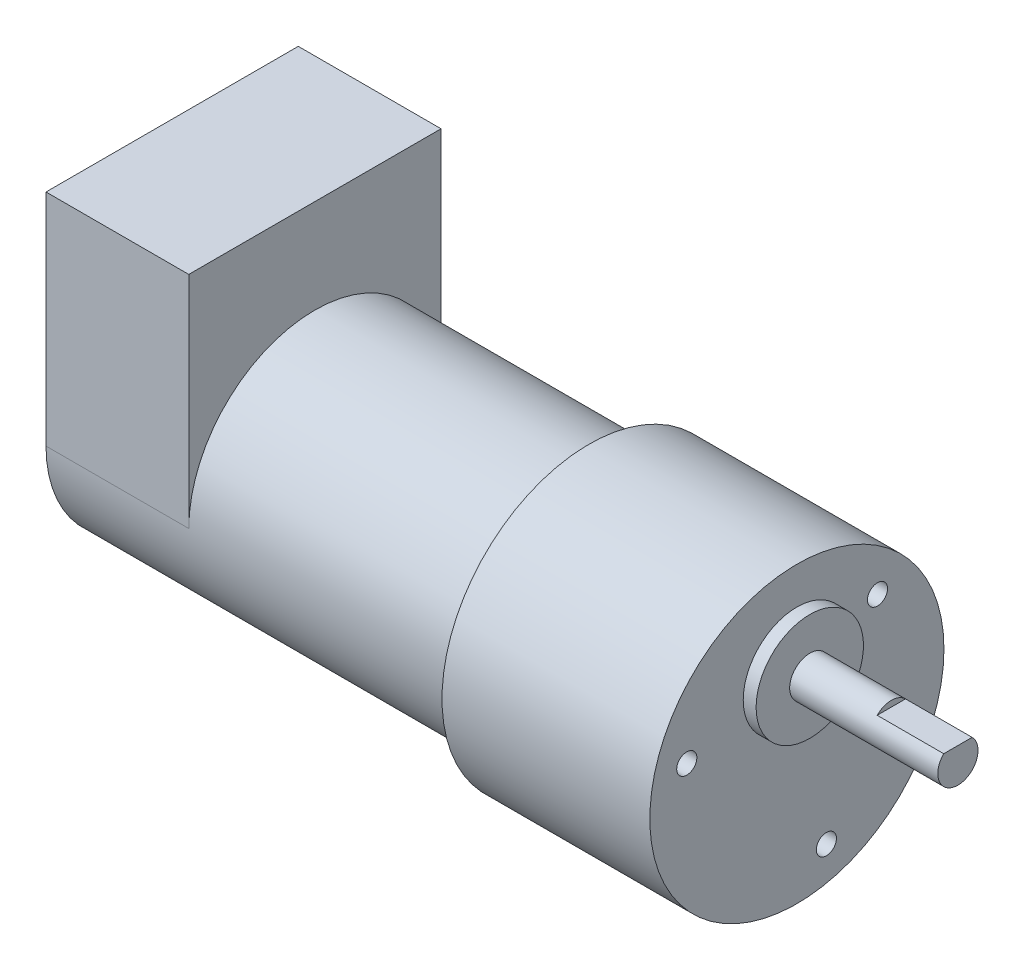
ISO-10303-21;
HEADER;
FILE_DESCRIPTION(('STEP AP214'),'2;1');
FILE_NAME('part.step','',(''),(''),'','','');
FILE_SCHEMA(('AUTOMOTIVE_DESIGN { 1 0 10303 214 1 1 1 1 }'));
ENDSEC;
DATA;
#1=APPLICATION_CONTEXT('core data for automotive mechanical design processes');
#2=APPLICATION_PROTOCOL_DEFINITION('international standard','automotive_design',2000,#1);
#3=PRODUCT_CONTEXT('',#1,'mechanical');
#4=PRODUCT('Part','Part','',(#3));
#5=PRODUCT_RELATED_PRODUCT_CATEGORY('part','',(#4));
#6=PRODUCT_DEFINITION_FORMATION('','',#4);
#7=PRODUCT_DEFINITION_CONTEXT('part definition',#1,'design');
#8=PRODUCT_DEFINITION('design','',#6,#7);
#9=PRODUCT_DEFINITION_SHAPE('','',#8);
#10=(LENGTH_UNIT() NAMED_UNIT(*) SI_UNIT(.MILLI.,.METRE.));
#11=(NAMED_UNIT(*) PLANE_ANGLE_UNIT() SI_UNIT($,.RADIAN.));
#12=(NAMED_UNIT(*) SI_UNIT($,.STERADIAN.) SOLID_ANGLE_UNIT());
#13=UNCERTAINTY_MEASURE_WITH_UNIT(LENGTH_MEASURE(1.E-05),#10,'distance_accuracy_value','');
#14=(GEOMETRIC_REPRESENTATION_CONTEXT(3) GLOBAL_UNCERTAINTY_ASSIGNED_CONTEXT((#13)) GLOBAL_UNIT_ASSIGNED_CONTEXT((#10,
#11,#12)) REPRESENTATION_CONTEXT('',''));
#15=CARTESIAN_POINT('',(0.,0.,0.));
#16=DIRECTION('',(0.,0.,1.));
#17=DIRECTION('',(1.,0.,0.));
#18=AXIS2_PLACEMENT_3D('',#15,#16,#17);
#19=CARTESIAN_POINT('',(73.914,0.,0.));
#20=DIRECTION('',(1.,0.,0.));
#21=DIRECTION('',(0.,0.,-1.));
#22=AXIS2_PLACEMENT_3D('',#19,#20,#21);
#23=PLANE('',#22);
#24=CARTESIAN_POINT('',(73.914,9.53703200057546,-9.53703200057543));
#25=DIRECTION('',(1.,0.,0.));
#26=DIRECTION('',(0.,0.,-1.));
#27=AXIS2_PLACEMENT_3D('',#24,#25,#26);
#28=CIRCLE('',#27,1.190625);
#29=CARTESIAN_POINT('',(73.914,9.53703200057546,-10.7276570005754));
#30=VERTEX_POINT('',#29);
#31=EDGE_CURVE('E103',#30,#30,#28,.T.);
#32=ORIENTED_EDGE('',*,*,#31,.F.);
#33=EDGE_LOOP('',(#32));
#34=FACE_BOUND('',#33,.T.);
#35=CARTESIAN_POINT('',(73.914,3.49079598891572,13.0278279894912));
#36=DIRECTION('',(1.,0.,0.));
#37=DIRECTION('',(0.,0.,-1.));
#38=AXIS2_PLACEMENT_3D('',#35,#36,#37);
#39=CIRCLE('',#38,1.190625);
#40=CARTESIAN_POINT('',(73.914,3.49079598891572,11.8372029894912));
#41=VERTEX_POINT('',#40);
#42=EDGE_CURVE('E110',#41,#41,#39,.T.);
#43=ORIENTED_EDGE('',*,*,#42,.F.);
#44=EDGE_LOOP('',(#43));
#45=FACE_BOUND('',#44,.T.);
#46=CARTESIAN_POINT('',(73.914,-13.0278279894912,-3.49079598891575));
#47=DIRECTION('',(1.,0.,0.));
#48=DIRECTION('',(0.,0.,-1.));
#49=AXIS2_PLACEMENT_3D('',#46,#47,#48);
#50=CIRCLE('',#49,1.190625);
#51=CARTESIAN_POINT('',(73.914,-13.0278279894912,-4.68142098891575));
#52=VERTEX_POINT('',#51);
#53=EDGE_CURVE('E116',#52,#52,#50,.T.);
#54=ORIENTED_EDGE('',*,*,#53,.F.);
#55=EDGE_LOOP('',(#54));
#56=FACE_BOUND('',#55,.T.);
#57=CARTESIAN_POINT('',(73.914,0.,0.));
#58=DIRECTION('',(1.,0.,0.));
#59=DIRECTION('',(0.,0.,-1.));
#60=AXIS2_PLACEMENT_3D('',#57,#58,#59);
#61=CIRCLE('',#60,17.399);
#62=CARTESIAN_POINT('',(73.914,0.,-17.399));
#63=VERTEX_POINT('',#62);
#64=EDGE_CURVE('E132',#63,#63,#61,.T.);
#65=ORIENTED_EDGE('',*,*,#64,.T.);
#66=EDGE_LOOP('',(#65));
#67=FACE_BOUND('',#66,.T.);
#68=CARTESIAN_POINT('',(73.914,6.6548,0.));
#69=DIRECTION('',(1.,0.,0.));
#70=DIRECTION('',(0.,0.,-1.));
#71=AXIS2_PLACEMENT_3D('',#68,#69,#70);
#72=CIRCLE('',#71,6.35);
#73=CARTESIAN_POINT('',(73.914,6.6548,6.35));
#74=VERTEX_POINT('',#73);
#75=EDGE_CURVE('E122',#74,#74,#72,.T.);
#76=ORIENTED_EDGE('',*,*,#75,.F.);
#77=EDGE_LOOP('',(#76));
#78=FACE_BOUND('',#77,.T.);
#79=ADVANCED_FACE('F33',(#34,#45,#56,#67,#78),#23,.T.);
#80=CARTESIAN_POINT('',(49.3268,0.,0.));
#81=DIRECTION('',(-1.,0.,0.));
#82=DIRECTION('',(0.,0.,1.));
#83=AXIS2_PLACEMENT_3D('',#80,#81,#82);
#84=CYLINDRICAL_SURFACE('',#83,14.9225);
#85=CARTESIAN_POINT('',(16.891,0.,0.));
#86=DIRECTION('',(1.,0.,0.));
#87=DIRECTION('',(0.,0.,-1.));
#88=AXIS2_PLACEMENT_3D('',#85,#86,#87);
#89=CIRCLE('',#88,14.9225);
#90=CARTESIAN_POINT('',(16.891,0.,-14.9225));
#91=VERTEX_POINT('',#90);
#92=CARTESIAN_POINT('',(16.891,0.,14.9225));
#93=VERTEX_POINT('',#92);
#94=EDGE_CURVE('E11',#91,#93,#89,.T.);
#95=ORIENTED_EDGE('',*,*,#94,.T.);
#96=DIRECTION('',(-1.,0.,0.));
#97=VECTOR('',#96,1.);
#98=CARTESIAN_POINT('',(16.891,0.,14.9225));
#99=LINE('',#98,#97);
#100=CARTESIAN_POINT('',(0.,0.,14.9225));
#101=VERTEX_POINT('',#100);
#102=EDGE_CURVE('E148',#93,#101,#99,.T.);
#103=ORIENTED_EDGE('',*,*,#102,.T.);
#104=CARTESIAN_POINT('',(0.,0.,0.));
#105=DIRECTION('',(1.,0.,0.));
#106=DIRECTION('',(0.,0.,-1.));
#107=AXIS2_PLACEMENT_3D('',#104,#105,#106);
#108=CIRCLE('',#107,14.9225);
#109=CARTESIAN_POINT('',(0.,0.,-14.9225));
#110=VERTEX_POINT('',#109);
#111=EDGE_CURVE('E157',#101,#110,#108,.T.);
#112=ORIENTED_EDGE('',*,*,#111,.T.);
#113=DIRECTION('',(-1.,0.,0.));
#114=VECTOR('',#113,1.);
#115=CARTESIAN_POINT('',(16.891,0.,-14.9225));
#116=LINE('',#115,#114);
#117=EDGE_CURVE('E55',#91,#110,#116,.T.);
#118=ORIENTED_EDGE('',*,*,#117,.F.);
#119=EDGE_LOOP('',(#95,#103,#112,#118));
#120=FACE_BOUND('',#119,.T.);
#121=CARTESIAN_POINT('',(49.3268,0.,0.));
#122=DIRECTION('',(1.,0.,0.));
#123=DIRECTION('',(0.,0.,-1.));
#124=AXIS2_PLACEMENT_3D('',#121,#122,#123);
#125=CIRCLE('',#124,14.9225);
#126=CARTESIAN_POINT('',(49.3268,0.,-14.9225));
#127=VERTEX_POINT('',#126);
#128=EDGE_CURVE('E42',#127,#127,#125,.T.);
#129=ORIENTED_EDGE('',*,*,#128,.F.);
#130=EDGE_LOOP('',(#129));
#131=FACE_BOUND('',#130,.T.);
#132=ADVANCED_FACE('F35',(#120,#131),#84,.T.);
#133=CARTESIAN_POINT('',(0.,0.,0.));
#134=DIRECTION('',(1.,0.,0.));
#135=DIRECTION('',(0.,0.,-1.));
#136=AXIS2_PLACEMENT_3D('',#133,#134,#135);
#137=PLANE('',#136);
#138=ORIENTED_EDGE('',*,*,#111,.F.);
#139=DIRECTION('',(0.,1.,0.));
#140=VECTOR('',#139,1.);
#141=CARTESIAN_POINT('',(0.,26.035,14.9225));
#142=LINE('',#141,#140);
#143=CARTESIAN_POINT('',(0.,26.035,14.9225));
#144=VERTEX_POINT('',#143);
#145=EDGE_CURVE('E135',#101,#144,#142,.T.);
#146=ORIENTED_EDGE('',*,*,#145,.T.);
#147=DIRECTION('',(0.,0.,-1.));
#148=VECTOR('',#147,1.);
#149=CARTESIAN_POINT('',(0.,26.035,-14.9225));
#150=LINE('',#149,#148);
#151=CARTESIAN_POINT('',(0.,26.035,-14.9225));
#152=VERTEX_POINT('',#151);
#153=EDGE_CURVE('E151',#144,#152,#150,.T.);
#154=ORIENTED_EDGE('',*,*,#153,.T.);
#155=DIRECTION('',(0.,-1.,0.));
#156=VECTOR('',#155,1.);
#157=CARTESIAN_POINT('',(0.,26.035,-14.9225));
#158=LINE('',#157,#156);
#159=EDGE_CURVE('E142',#152,#110,#158,.T.);
#160=ORIENTED_EDGE('',*,*,#159,.T.);
#161=EDGE_LOOP('',(#138,#146,#154,#160));
#162=FACE_BOUND('',#161,.T.);
#163=ADVANCED_FACE('F174',(#162),#137,.F.);
#164=CARTESIAN_POINT('',(16.891,0.,0.));
#165=DIRECTION('',(1.,0.,0.));
#166=DIRECTION('',(0.,0.,-1.));
#167=AXIS2_PLACEMENT_3D('',#164,#165,#166);
#168=PLANE('',#167);
#169=ORIENTED_EDGE('',*,*,#94,.F.);
#170=DIRECTION('',(0.,-1.,0.));
#171=VECTOR('',#170,1.);
#172=CARTESIAN_POINT('',(16.891,26.035,-14.9225));
#173=LINE('',#172,#171);
#174=CARTESIAN_POINT('',(16.891,26.035,-14.9225));
#175=VERTEX_POINT('',#174);
#176=EDGE_CURVE('E145',#175,#91,#173,.T.);
#177=ORIENTED_EDGE('',*,*,#176,.F.);
#178=DIRECTION('',(0.,0.,-1.));
#179=VECTOR('',#178,1.);
#180=CARTESIAN_POINT('',(16.891,26.035,-14.9225));
#181=LINE('',#180,#179);
#182=CARTESIAN_POINT('',(16.891,26.035,14.9225));
#183=VERTEX_POINT('',#182);
#184=EDGE_CURVE('E141',#183,#175,#181,.T.);
#185=ORIENTED_EDGE('',*,*,#184,.F.);
#186=DIRECTION('',(0.,1.,0.));
#187=VECTOR('',#186,1.);
#188=CARTESIAN_POINT('',(16.891,26.035,14.9225));
#189=LINE('',#188,#187);
#190=EDGE_CURVE('E138',#93,#183,#189,.T.);
#191=ORIENTED_EDGE('',*,*,#190,.F.);
#192=EDGE_LOOP('',(#169,#177,#185,#191));
#193=FACE_BOUND('',#192,.T.);
#194=ADVANCED_FACE('F181',(#193),#168,.T.);
#195=CARTESIAN_POINT('',(16.891,26.035,-14.9225));
#196=DIRECTION('',(0.,0.,-1.));
#197=DIRECTION('',(0.,1.,0.));
#198=AXIS2_PLACEMENT_3D('',#195,#196,#197);
#199=PLANE('',#198);
#200=ORIENTED_EDGE('',*,*,#159,.F.);
#201=DIRECTION('',(-1.,0.,0.));
#202=VECTOR('',#201,1.);
#203=CARTESIAN_POINT('',(16.891,26.035,-14.9225));
#204=LINE('',#203,#202);
#205=EDGE_CURVE('E158',#175,#152,#204,.T.);
#206=ORIENTED_EDGE('',*,*,#205,.F.);
#207=ORIENTED_EDGE('',*,*,#176,.T.);
#208=ORIENTED_EDGE('',*,*,#117,.T.);
#209=EDGE_LOOP('',(#200,#206,#207,#208));
#210=FACE_BOUND('',#209,.T.);
#211=ADVANCED_FACE('F172',(#210),#199,.T.);
#212=CARTESIAN_POINT('',(16.891,26.035,-14.9225));
#213=DIRECTION('',(0.,1.,0.));
#214=DIRECTION('',(0.,0.,1.));
#215=AXIS2_PLACEMENT_3D('',#212,#213,#214);
#216=PLANE('',#215);
#217=ORIENTED_EDGE('',*,*,#153,.F.);
#218=DIRECTION('',(-1.,0.,0.));
#219=VECTOR('',#218,1.);
#220=CARTESIAN_POINT('',(16.891,26.035,14.9225));
#221=LINE('',#220,#219);
#222=EDGE_CURVE('E160',#183,#144,#221,.T.);
#223=ORIENTED_EDGE('',*,*,#222,.F.);
#224=ORIENTED_EDGE('',*,*,#184,.T.);
#225=ORIENTED_EDGE('',*,*,#205,.T.);
#226=EDGE_LOOP('',(#217,#223,#224,#225));
#227=FACE_BOUND('',#226,.T.);
#228=ADVANCED_FACE('F177',(#227),#216,.T.);
#229=CARTESIAN_POINT('',(16.891,26.035,14.9225));
#230=DIRECTION('',(0.,0.,1.));
#231=DIRECTION('',(0.,-1.,0.));
#232=AXIS2_PLACEMENT_3D('',#229,#230,#231);
#233=PLANE('',#232);
#234=ORIENTED_EDGE('',*,*,#145,.F.);
#235=ORIENTED_EDGE('',*,*,#102,.F.);
#236=ORIENTED_EDGE('',*,*,#190,.T.);
#237=ORIENTED_EDGE('',*,*,#222,.T.);
#238=EDGE_LOOP('',(#234,#235,#236,#237));
#239=FACE_BOUND('',#238,.T.);
#240=ADVANCED_FACE('F183',(#239),#233,.T.);
#241=CARTESIAN_POINT('',(49.3268,0.,0.));
#242=DIRECTION('',(1.,0.,0.));
#243=DIRECTION('',(0.,0.,-1.));
#244=AXIS2_PLACEMENT_3D('',#241,#242,#243);
#245=PLANE('',#244);
#246=CARTESIAN_POINT('',(49.3268,0.,0.));
#247=DIRECTION('',(1.,0.,0.));
#248=DIRECTION('',(0.,0.,-1.));
#249=AXIS2_PLACEMENT_3D('',#246,#247,#248);
#250=CIRCLE('',#249,17.399);
#251=CARTESIAN_POINT('',(49.3268,0.,-17.399));
#252=VERTEX_POINT('',#251);
#253=EDGE_CURVE('E131',#252,#252,#250,.T.);
#254=ORIENTED_EDGE('',*,*,#253,.F.);
#255=EDGE_LOOP('',(#254));
#256=FACE_BOUND('',#255,.T.);
#257=ORIENTED_EDGE('',*,*,#128,.T.);
#258=EDGE_LOOP('',(#257));
#259=FACE_BOUND('',#258,.T.);
#260=ADVANCED_FACE('F185',(#256,#259),#245,.F.);
#261=CARTESIAN_POINT('',(73.914,0.,0.));
#262=DIRECTION('',(-1.,0.,0.));
#263=DIRECTION('',(0.,0.,1.));
#264=AXIS2_PLACEMENT_3D('',#261,#262,#263);
#265=CYLINDRICAL_SURFACE('',#264,17.399);
#266=ORIENTED_EDGE('',*,*,#64,.F.);
#267=EDGE_LOOP('',(#266));
#268=FACE_BOUND('',#267,.T.);
#269=ORIENTED_EDGE('',*,*,#253,.T.);
#270=EDGE_LOOP('',(#269));
#271=FACE_BOUND('',#270,.T.);
#272=ADVANCED_FACE('F191',(#268,#271),#265,.T.);
#273=CARTESIAN_POINT('',(75.438,6.6548,0.));
#274=DIRECTION('',(1.,0.,0.));
#275=DIRECTION('',(0.,0.,-1.));
#276=AXIS2_PLACEMENT_3D('',#273,#274,#275);
#277=PLANE('',#276);
#278=CARTESIAN_POINT('',(75.438,6.6548,0.));
#279=DIRECTION('',(1.,0.,0.));
#280=DIRECTION('',(0.,0.,-1.));
#281=AXIS2_PLACEMENT_3D('',#278,#279,#280);
#282=CIRCLE('',#281,6.35);
#283=CARTESIAN_POINT('',(75.438,6.6548,6.35));
#284=VERTEX_POINT('',#283);
#285=EDGE_CURVE('E125',#284,#284,#282,.T.);
#286=ORIENTED_EDGE('',*,*,#285,.T.);
#287=EDGE_LOOP('',(#286));
#288=FACE_BOUND('',#287,.T.);
#289=CARTESIAN_POINT('',(75.438,6.6548,0.));
#290=DIRECTION('',(1.,0.,0.));
#291=DIRECTION('',(0.,0.,-1.));
#292=AXIS2_PLACEMENT_3D('',#289,#290,#291);
#293=CIRCLE('',#292,2.37871);
#294=CARTESIAN_POINT('',(75.438,6.6548,-2.37871));
#295=VERTEX_POINT('',#294);
#296=EDGE_CURVE('E37',#295,#295,#293,.T.);
#297=ORIENTED_EDGE('',*,*,#296,.F.);
#298=EDGE_LOOP('',(#297));
#299=FACE_BOUND('',#298,.T.);
#300=ADVANCED_FACE('F208',(#288,#299),#277,.T.);
#301=CARTESIAN_POINT('',(75.438,6.6548,0.));
#302=DIRECTION('',(-1.,0.,0.));
#303=DIRECTION('',(0.,0.,1.));
#304=AXIS2_PLACEMENT_3D('',#301,#302,#303);
#305=CYLINDRICAL_SURFACE('',#304,6.35);
#306=CARTESIAN_POINT('',(75.438,6.6548,6.35));
#307=CARTESIAN_POINT('',(75.422125,6.6548,6.35));
#308=CARTESIAN_POINT('',(75.40625,6.6548,6.35));
#309=CARTESIAN_POINT('',(75.3745,6.6548,6.35));
#310=CARTESIAN_POINT('',(75.358625,6.6548,6.35));
#311=CARTESIAN_POINT('',(75.326875,6.6548,6.35));
#312=CARTESIAN_POINT('',(75.311,6.6548,6.35));
#313=CARTESIAN_POINT('',(75.27925,6.6548,6.35));
#314=CARTESIAN_POINT('',(75.263375,6.6548,6.35));
#315=CARTESIAN_POINT('',(75.231625,6.6548,6.35));
#316=CARTESIAN_POINT('',(75.21575,6.6548,6.35));
#317=CARTESIAN_POINT('',(75.184,6.6548,6.35));
#318=CARTESIAN_POINT('',(75.168125,6.6548,6.35));
#319=CARTESIAN_POINT('',(75.136375,6.6548,6.35));
#320=CARTESIAN_POINT('',(75.1205,6.6548,6.35));
#321=CARTESIAN_POINT('',(75.08875,6.6548,6.35));
#322=CARTESIAN_POINT('',(75.072875,6.6548,6.35));
#323=CARTESIAN_POINT('',(75.041125,6.6548,6.35));
#324=CARTESIAN_POINT('',(75.02525,6.6548,6.35));
#325=CARTESIAN_POINT('',(74.9935,6.6548,6.35));
#326=CARTESIAN_POINT('',(74.977625,6.6548,6.35));
#327=CARTESIAN_POINT('',(74.945875,6.6548,6.35));
#328=CARTESIAN_POINT('',(74.93,6.6548,6.35));
#329=CARTESIAN_POINT('',(74.89825,6.6548,6.35));
#330=CARTESIAN_POINT('',(74.882375,6.6548,6.35));
#331=CARTESIAN_POINT('',(74.850625,6.6548,6.35));
#332=CARTESIAN_POINT('',(74.83475,6.6548,6.35));
#333=CARTESIAN_POINT('',(74.803,6.6548,6.35));
#334=CARTESIAN_POINT('',(74.787125,6.6548,6.35));
#335=CARTESIAN_POINT('',(74.755375,6.6548,6.35));
#336=CARTESIAN_POINT('',(74.7395,6.6548,6.35));
#337=CARTESIAN_POINT('',(74.70775,6.6548,6.35));
#338=CARTESIAN_POINT('',(74.691875,6.6548,6.35));
#339=CARTESIAN_POINT('',(74.660125,6.6548,6.35));
#340=CARTESIAN_POINT('',(74.64425,6.6548,6.35));
#341=CARTESIAN_POINT('',(74.6125,6.6548,6.35));
#342=CARTESIAN_POINT('',(74.596625,6.6548,6.35));
#343=CARTESIAN_POINT('',(74.564875,6.6548,6.35));
#344=CARTESIAN_POINT('',(74.549,6.6548,6.35));
#345=CARTESIAN_POINT('',(74.51725,6.6548,6.35));
#346=CARTESIAN_POINT('',(74.501375,6.6548,6.35));
#347=CARTESIAN_POINT('',(74.469625,6.6548,6.35));
#348=CARTESIAN_POINT('',(74.45375,6.6548,6.35));
#349=CARTESIAN_POINT('',(74.422,6.6548,6.35));
#350=CARTESIAN_POINT('',(74.406125,6.6548,6.35));
#351=CARTESIAN_POINT('',(74.374375,6.6548,6.35));
#352=CARTESIAN_POINT('',(74.3585,6.6548,6.35));
#353=CARTESIAN_POINT('',(74.32675,6.6548,6.35));
#354=CARTESIAN_POINT('',(74.310875,6.6548,6.35));
#355=CARTESIAN_POINT('',(74.279125,6.6548,6.35));
#356=CARTESIAN_POINT('',(74.26325,6.6548,6.35));
#357=CARTESIAN_POINT('',(74.2315,6.6548,6.35));
#358=CARTESIAN_POINT('',(74.215625,6.6548,6.35));
#359=CARTESIAN_POINT('',(74.183875,6.6548,6.35));
#360=CARTESIAN_POINT('',(74.168,6.6548,6.35));
#361=CARTESIAN_POINT('',(74.13625,6.6548,6.35));
#362=CARTESIAN_POINT('',(74.120375,6.6548,6.35));
#363=CARTESIAN_POINT('',(74.088625,6.6548,6.35));
#364=CARTESIAN_POINT('',(74.07275,6.6548,6.35));
#365=CARTESIAN_POINT('',(74.041,6.6548,6.35));
#366=CARTESIAN_POINT('',(74.025125,6.6548,6.35));
#367=CARTESIAN_POINT('',(73.993375,6.6548,6.35));
#368=CARTESIAN_POINT('',(73.9775,6.6548,6.35));
#369=CARTESIAN_POINT('',(73.94575,6.6548,6.35));
#370=CARTESIAN_POINT('',(73.929875,6.6548,6.35));
#371=CARTESIAN_POINT('',(73.914,6.6548,6.35));
#372=B_SPLINE_CURVE_WITH_KNOTS('',3,(#306,#307,#308,#309,#310,#311,#312,#313,#314,#315,#316,
#317,#318,#319,#320,#321,#322,#323,#324,#325,#326,#327,#328,#329,#330,#331,#332,#333,#334,#335,
#336,#337,#338,#339,#340,#341,#342,#343,#344,#345,#346,#347,#348,#349,#350,#351,#352,#353,#354,
#355,#356,#357,#358,#359,#360,#361,#362,#363,#364,#365,#366,#367,#368,#369,#370,#371),
.UNSPECIFIED.,.F.,.F.,(4,2,2,2,2,2,2,2,2,2,2,2,2,2,2,2,2,2,2,2,2,2,2,2,2,2,2,2,2,2,2,2,4),(0.,
0.0476249999999956,0.0952499999999912,0.142874999999987,0.190499999999996,0.238124999999992,
0.285749999999987,0.333374999999997,0.380999999999992,0.428624999999988,0.476249999999998,
0.523874999999993,0.571499999999989,0.619124999999998,0.666749999999994,0.714374999999989,
0.761999999999985,0.809624999999994,0.85724999999999,0.904874999999986,0.952499999999995,
1.00012499999999,1.04774999999999,1.095375,1.14299999999999,1.19062499999999,1.23825,
1.28587499999999,1.33349999999999,1.381125,1.42874999999999,1.47637499999999,1.52399999999998),.UNSPECIFIED.);
#373=EDGE_CURVE('BSEAM248',#284,#74,#372,.T.);
#374=ORIENTED_EDGE('',*,*,#285,.F.);
#375=ORIENTED_EDGE('',*,*,#75,.T.);
#376=ORIENTED_EDGE('',*,*,#373,.T.);
#377=ORIENTED_EDGE('',*,*,#373,.F.);
#378=EDGE_LOOP('',(#374,#376,#375,#377));
#379=FACE_BOUND('',#378,.T.);
#380=ADVANCED_FACE('F248',(#379),#305,.T.);
#381=CARTESIAN_POINT('',(92.964,6.6548,0.));
#382=DIRECTION('',(1.,0.,0.));
#383=DIRECTION('',(0.,0.,-1.));
#384=AXIS2_PLACEMENT_3D('',#381,#382,#383);
#385=PLANE('',#384);
#386=DIRECTION('',(0.,0.,-1.));
#387=VECTOR('',#386,1.);
#388=CARTESIAN_POINT('',(92.964,8.34009,1.6787075028128));
#389=LINE('',#388,#387);
#390=CARTESIAN_POINT('',(92.964,8.34009,1.6787075028128));
#391=VERTEX_POINT('',#390);
#392=CARTESIAN_POINT('',(92.964,8.34009,-1.6787075028128));
#393=VERTEX_POINT('',#392);
#394=EDGE_CURVE('E89',#391,#393,#389,.T.);
#395=ORIENTED_EDGE('',*,*,#394,.F.);
#396=CARTESIAN_POINT('',(92.964,6.6548,0.));
#397=DIRECTION('',(1.,0.,0.));
#398=DIRECTION('',(0.,0.,-1.));
#399=AXIS2_PLACEMENT_3D('',#396,#397,#398);
#400=CIRCLE('',#399,2.37871);
#401=EDGE_CURVE('E101',#391,#393,#400,.T.);
#402=ORIENTED_EDGE('',*,*,#401,.T.);
#403=EDGE_LOOP('',(#395,#402));
#404=FACE_BOUND('',#403,.T.);
#405=ADVANCED_FACE('F258',(#404),#385,.T.);
#406=CARTESIAN_POINT('',(92.964,6.6548,0.));
#407=DIRECTION('',(-1.,0.,0.));
#408=DIRECTION('',(0.,0.,1.));
#409=AXIS2_PLACEMENT_3D('',#406,#407,#408);
#410=CYLINDRICAL_SURFACE('',#409,2.37871);
#411=ORIENTED_EDGE('',*,*,#401,.F.);
#412=DIRECTION('',(1.,0.,0.));
#413=VECTOR('',#412,1.);
#414=CARTESIAN_POINT('',(85.09,8.34009,1.6787075028128));
#415=LINE('',#414,#413);
#416=CARTESIAN_POINT('',(85.09,8.34009,1.6787075028128));
#417=VERTEX_POINT('',#416);
#418=EDGE_CURVE('E93',#417,#391,#415,.T.);
#419=ORIENTED_EDGE('',*,*,#418,.F.);
#420=CARTESIAN_POINT('',(85.09,6.6548,0.));
#421=DIRECTION('',(1.,0.,0.));
#422=DIRECTION('',(0.,0.,-1.));
#423=AXIS2_PLACEMENT_3D('',#420,#421,#422);
#424=CIRCLE('',#423,2.37871);
#425=CARTESIAN_POINT('',(85.09,8.34009,-1.6787075028128));
#426=VERTEX_POINT('',#425);
#427=EDGE_CURVE('E84',#426,#417,#424,.T.);
#428=ORIENTED_EDGE('',*,*,#427,.F.);
#429=DIRECTION('',(1.,0.,0.));
#430=VECTOR('',#429,1.);
#431=CARTESIAN_POINT('',(85.09,8.34009,-1.6787075028128));
#432=LINE('',#431,#430);
#433=EDGE_CURVE('E95',#426,#393,#432,.T.);
#434=ORIENTED_EDGE('',*,*,#433,.T.);
#435=EDGE_LOOP('',(#411,#419,#428,#434));
#436=FACE_BOUND('',#435,.T.);
#437=ORIENTED_EDGE('',*,*,#296,.T.);
#438=EDGE_LOOP('',(#437));
#439=FACE_BOUND('',#438,.T.);
#440=ADVANCED_FACE('F98',(#436,#439),#410,.T.);
#441=CARTESIAN_POINT('',(54.864,-13.0278279894912,-3.49079598891575));
#442=DIRECTION('',(1.,0.,0.));
#443=DIRECTION('',(0.,0.,-1.));
#444=AXIS2_PLACEMENT_3D('',#441,#442,#443);
#445=CYLINDRICAL_SURFACE('',#444,1.190625);
#446=CARTESIAN_POINT('',(54.864,-13.0278279894912,-3.49079598891575));
#447=DIRECTION('',(1.,0.,0.));
#448=DIRECTION('',(0.,0.,-1.));
#449=AXIS2_PLACEMENT_3D('',#446,#447,#448);
#450=CIRCLE('',#449,1.190625);
#451=CARTESIAN_POINT('',(54.864,-13.0278279894912,-4.68142098891575));
#452=VERTEX_POINT('',#451);
#453=EDGE_CURVE('E119',#452,#452,#450,.T.);
#454=CARTESIAN_POINT('',(54.864,-13.0278279894912,-4.68142098891575));
#455=CARTESIAN_POINT('',(55.0624375,-13.0278279894912,-4.68142098891575));
#456=CARTESIAN_POINT('',(55.260875,-13.0278279894912,-4.68142098891575));
#457=CARTESIAN_POINT('',(55.65775,-13.0278279894912,-4.68142098891575));
#458=CARTESIAN_POINT('',(55.8561875,-13.0278279894912,-4.68142098891575));
#459=CARTESIAN_POINT('',(56.2530625,-13.0278279894912,-4.68142098891575));
#460=CARTESIAN_POINT('',(56.4515,-13.0278279894912,-4.68142098891575));
#461=CARTESIAN_POINT('',(56.848375,-13.0278279894912,-4.68142098891575));
#462=CARTESIAN_POINT('',(57.0468125,-13.0278279894912,-4.68142098891575));
#463=CARTESIAN_POINT('',(57.4436875,-13.0278279894912,-4.68142098891575));
#464=CARTESIAN_POINT('',(57.642125,-13.0278279894912,-4.68142098891575));
#465=CARTESIAN_POINT('',(58.039,-13.0278279894912,-4.68142098891575));
#466=CARTESIAN_POINT('',(58.2374375,-13.0278279894912,-4.68142098891575));
#467=CARTESIAN_POINT('',(58.6343125,-13.0278279894912,-4.68142098891575));
#468=CARTESIAN_POINT('',(58.83275,-13.0278279894912,-4.68142098891575));
#469=CARTESIAN_POINT('',(59.229625,-13.0278279894912,-4.68142098891575));
#470=CARTESIAN_POINT('',(59.4280625,-13.0278279894912,-4.68142098891575));
#471=CARTESIAN_POINT('',(59.8249375,-13.0278279894912,-4.68142098891575));
#472=CARTESIAN_POINT('',(60.023375,-13.0278279894912,-4.68142098891575));
#473=CARTESIAN_POINT('',(60.42025,-13.0278279894912,-4.68142098891575));
#474=CARTESIAN_POINT('',(60.6186875,-13.0278279894912,-4.68142098891575));
#475=CARTESIAN_POINT('',(61.0155625,-13.0278279894912,-4.68142098891575));
#476=CARTESIAN_POINT('',(61.214,-13.0278279894912,-4.68142098891575));
#477=CARTESIAN_POINT('',(61.610875,-13.0278279894912,-4.68142098891575));
#478=CARTESIAN_POINT('',(61.8093125,-13.0278279894912,-4.68142098891575));
#479=CARTESIAN_POINT('',(62.2061875,-13.0278279894912,-4.68142098891575));
#480=CARTESIAN_POINT('',(62.404625,-13.0278279894912,-4.68142098891575));
#481=CARTESIAN_POINT('',(62.8015,-13.0278279894912,-4.68142098891575));
#482=CARTESIAN_POINT('',(62.9999375,-13.0278279894912,-4.68142098891575));
#483=CARTESIAN_POINT('',(63.3968125,-13.0278279894912,-4.68142098891575));
#484=CARTESIAN_POINT('',(63.59525,-13.0278279894912,-4.68142098891575));
#485=CARTESIAN_POINT('',(63.992125,-13.0278279894912,-4.68142098891575));
#486=CARTESIAN_POINT('',(64.1905625,-13.0278279894912,-4.68142098891575));
#487=CARTESIAN_POINT('',(64.5874375,-13.0278279894912,-4.68142098891575));
#488=CARTESIAN_POINT('',(64.785875,-13.0278279894912,-4.68142098891575));
#489=CARTESIAN_POINT('',(65.18275,-13.0278279894912,-4.68142098891575));
#490=CARTESIAN_POINT('',(65.3811875,-13.0278279894912,-4.68142098891575));
#491=CARTESIAN_POINT('',(65.7780625,-13.0278279894912,-4.68142098891575));
#492=CARTESIAN_POINT('',(65.9765,-13.0278279894912,-4.68142098891575));
#493=CARTESIAN_POINT('',(66.373375,-13.0278279894912,-4.68142098891575));
#494=CARTESIAN_POINT('',(66.5718125,-13.0278279894912,-4.68142098891575));
#495=CARTESIAN_POINT('',(66.9686875,-13.0278279894912,-4.68142098891575));
#496=CARTESIAN_POINT('',(67.167125,-13.0278279894912,-4.68142098891575));
#497=CARTESIAN_POINT('',(67.564,-13.0278279894912,-4.68142098891575));
#498=CARTESIAN_POINT('',(67.7624375,-13.0278279894912,-4.68142098891575));
#499=CARTESIAN_POINT('',(68.1593125,-13.0278279894912,-4.68142098891575));
#500=CARTESIAN_POINT('',(68.35775,-13.0278279894912,-4.68142098891575));
#501=CARTESIAN_POINT('',(68.754625,-13.0278279894912,-4.68142098891575));
#502=CARTESIAN_POINT('',(68.9530625,-13.0278279894912,-4.68142098891575));
#503=CARTESIAN_POINT('',(69.3499375,-13.0278279894912,-4.68142098891575));
#504=CARTESIAN_POINT('',(69.548375,-13.0278279894912,-4.68142098891575));
#505=CARTESIAN_POINT('',(69.94525,-13.0278279894912,-4.68142098891575));
#506=CARTESIAN_POINT('',(70.1436875,-13.0278279894912,-4.68142098891575));
#507=CARTESIAN_POINT('',(70.5405625,-13.0278279894912,-4.68142098891575));
#508=CARTESIAN_POINT('',(70.739,-13.0278279894912,-4.68142098891575));
#509=CARTESIAN_POINT('',(71.135875,-13.0278279894912,-4.68142098891575));
#510=CARTESIAN_POINT('',(71.3343125,-13.0278279894912,-4.68142098891575));
#511=CARTESIAN_POINT('',(71.7311875,-13.0278279894912,-4.68142098891575));
#512=CARTESIAN_POINT('',(71.929625,-13.0278279894912,-4.68142098891575));
#513=CARTESIAN_POINT('',(72.3265,-13.0278279894912,-4.68142098891575));
#514=CARTESIAN_POINT('',(72.5249375,-13.0278279894912,-4.68142098891575));
#515=CARTESIAN_POINT('',(72.9218125,-13.0278279894912,-4.68142098891575));
#516=CARTESIAN_POINT('',(73.12025,-13.0278279894912,-4.68142098891575));
#517=CARTESIAN_POINT('',(73.517125,-13.0278279894912,-4.68142098891575));
#518=CARTESIAN_POINT('',(73.7155625,-13.0278279894912,-4.68142098891575));
#519=CARTESIAN_POINT('',(73.914,-13.0278279894912,-4.68142098891575));
#520=B_SPLINE_CURVE_WITH_KNOTS('',3,(#454,#455,#456,#457,#458,#459,#460,#461,#462,#463,#464,
#465,#466,#467,#468,#469,#470,#471,#472,#473,#474,#475,#476,#477,#478,#479,#480,#481,#482,#483,
#484,#485,#486,#487,#488,#489,#490,#491,#492,#493,#494,#495,#496,#497,#498,#499,#500,#501,#502,
#503,#504,#505,#506,#507,#508,#509,#510,#511,#512,#513,#514,#515,#516,#517,#518,#519),
.UNSPECIFIED.,.F.,.F.,(4,2,2,2,2,2,2,2,2,2,2,2,2,2,2,2,2,2,2,2,2,2,2,2,2,2,2,2,2,2,2,2,4),(0.,
0.595312499999993,1.19062499999999,1.78593749999999,2.38124999999999,2.97656249999999,3.571875,
4.1671875,4.7625,5.3578125,5.953125,6.5484375,7.14375,7.73906249999999,8.33437499999999,
8.92968749999999,9.52499999999999,10.1203125,10.715625,11.3109375,11.90625,12.5015625,13.096875,
13.6921875,14.2875,14.8828125,15.478125,16.0734375,16.66875,17.2640625,17.859375,18.4546875,
19.05),.UNSPECIFIED.);
#521=EDGE_CURVE('BSEAM271',#452,#52,#520,.T.);
#522=ORIENTED_EDGE('',*,*,#453,.F.);
#523=ORIENTED_EDGE('',*,*,#53,.T.);
#524=ORIENTED_EDGE('',*,*,#521,.T.);
#525=ORIENTED_EDGE('',*,*,#521,.F.);
#526=EDGE_LOOP('',(#522,#524,#523,#525));
#527=FACE_BOUND('',#526,.T.);
#528=ADVANCED_FACE('F271',(#527),#445,.F.);
#529=CARTESIAN_POINT('',(54.864,-13.0278279894912,-3.49079598891575));
#530=DIRECTION('',(1.,0.,0.));
#531=DIRECTION('',(0.,0.,-1.));
#532=AXIS2_PLACEMENT_3D('',#529,#530,#531);
#533=PLANE('',#532);
#534=ORIENTED_EDGE('',*,*,#453,.T.);
#535=EDGE_LOOP('',(#534));
#536=FACE_BOUND('',#535,.T.);
#537=ADVANCED_FACE('F275',(#536),#533,.T.);
#538=CARTESIAN_POINT('',(54.864,3.49079598891572,13.0278279894912));
#539=DIRECTION('',(1.,0.,0.));
#540=DIRECTION('',(0.,0.,-1.));
#541=AXIS2_PLACEMENT_3D('',#538,#539,#540);
#542=CYLINDRICAL_SURFACE('',#541,1.190625);
#543=CARTESIAN_POINT('',(54.864,3.49079598891572,13.0278279894912));
#544=DIRECTION('',(1.,0.,0.));
#545=DIRECTION('',(0.,0.,-1.));
#546=AXIS2_PLACEMENT_3D('',#543,#544,#545);
#547=CIRCLE('',#546,1.190625);
#548=CARTESIAN_POINT('',(54.864,3.49079598891572,11.8372029894912));
#549=VERTEX_POINT('',#548);
#550=EDGE_CURVE('E113',#549,#549,#547,.T.);
#551=CARTESIAN_POINT('',(54.864,3.49079598891572,11.8372029894912));
#552=CARTESIAN_POINT('',(55.0624375,3.49079598891572,11.8372029894912));
#553=CARTESIAN_POINT('',(55.260875,3.49079598891572,11.8372029894912));
#554=CARTESIAN_POINT('',(55.65775,3.49079598891572,11.8372029894912));
#555=CARTESIAN_POINT('',(55.8561875,3.49079598891572,11.8372029894912));
#556=CARTESIAN_POINT('',(56.2530625,3.49079598891572,11.8372029894912));
#557=CARTESIAN_POINT('',(56.4515,3.49079598891572,11.8372029894912));
#558=CARTESIAN_POINT('',(56.848375,3.49079598891572,11.8372029894912));
#559=CARTESIAN_POINT('',(57.0468125,3.49079598891572,11.8372029894912));
#560=CARTESIAN_POINT('',(57.4436875,3.49079598891572,11.8372029894912));
#561=CARTESIAN_POINT('',(57.642125,3.49079598891572,11.8372029894912));
#562=CARTESIAN_POINT('',(58.039,3.49079598891572,11.8372029894912));
#563=CARTESIAN_POINT('',(58.2374375,3.49079598891572,11.8372029894912));
#564=CARTESIAN_POINT('',(58.6343125,3.49079598891572,11.8372029894912));
#565=CARTESIAN_POINT('',(58.83275,3.49079598891572,11.8372029894912));
#566=CARTESIAN_POINT('',(59.229625,3.49079598891572,11.8372029894912));
#567=CARTESIAN_POINT('',(59.4280625,3.49079598891572,11.8372029894912));
#568=CARTESIAN_POINT('',(59.8249375,3.49079598891572,11.8372029894912));
#569=CARTESIAN_POINT('',(60.023375,3.49079598891572,11.8372029894912));
#570=CARTESIAN_POINT('',(60.42025,3.49079598891572,11.8372029894912));
#571=CARTESIAN_POINT('',(60.6186875,3.49079598891572,11.8372029894912));
#572=CARTESIAN_POINT('',(61.0155625,3.49079598891572,11.8372029894912));
#573=CARTESIAN_POINT('',(61.214,3.49079598891572,11.8372029894912));
#574=CARTESIAN_POINT('',(61.610875,3.49079598891572,11.8372029894912));
#575=CARTESIAN_POINT('',(61.8093125,3.49079598891572,11.8372029894912));
#576=CARTESIAN_POINT('',(62.2061875,3.49079598891572,11.8372029894912));
#577=CARTESIAN_POINT('',(62.404625,3.49079598891572,11.8372029894912));
#578=CARTESIAN_POINT('',(62.8015,3.49079598891572,11.8372029894912));
#579=CARTESIAN_POINT('',(62.9999375,3.49079598891572,11.8372029894912));
#580=CARTESIAN_POINT('',(63.3968125,3.49079598891572,11.8372029894912));
#581=CARTESIAN_POINT('',(63.59525,3.49079598891572,11.8372029894912));
#582=CARTESIAN_POINT('',(63.992125,3.49079598891572,11.8372029894912));
#583=CARTESIAN_POINT('',(64.1905625,3.49079598891572,11.8372029894912));
#584=CARTESIAN_POINT('',(64.5874375,3.49079598891572,11.8372029894912));
#585=CARTESIAN_POINT('',(64.785875,3.49079598891572,11.8372029894912));
#586=CARTESIAN_POINT('',(65.18275,3.49079598891572,11.8372029894912));
#587=CARTESIAN_POINT('',(65.3811875,3.49079598891572,11.8372029894912));
#588=CARTESIAN_POINT('',(65.7780625,3.49079598891572,11.8372029894912));
#589=CARTESIAN_POINT('',(65.9765,3.49079598891572,11.8372029894912));
#590=CARTESIAN_POINT('',(66.373375,3.49079598891572,11.8372029894912));
#591=CARTESIAN_POINT('',(66.5718125,3.49079598891572,11.8372029894912));
#592=CARTESIAN_POINT('',(66.9686875,3.49079598891572,11.8372029894912));
#593=CARTESIAN_POINT('',(67.167125,3.49079598891572,11.8372029894912));
#594=CARTESIAN_POINT('',(67.564,3.49079598891572,11.8372029894912));
#595=CARTESIAN_POINT('',(67.7624375,3.49079598891572,11.8372029894912));
#596=CARTESIAN_POINT('',(68.1593125,3.49079598891572,11.8372029894912));
#597=CARTESIAN_POINT('',(68.35775,3.49079598891572,11.8372029894912));
#598=CARTESIAN_POINT('',(68.754625,3.49079598891572,11.8372029894912));
#599=CARTESIAN_POINT('',(68.9530625,3.49079598891572,11.8372029894912));
#600=CARTESIAN_POINT('',(69.3499375,3.49079598891572,11.8372029894912));
#601=CARTESIAN_POINT('',(69.548375,3.49079598891572,11.8372029894912));
#602=CARTESIAN_POINT('',(69.94525,3.49079598891572,11.8372029894912));
#603=CARTESIAN_POINT('',(70.1436875,3.49079598891572,11.8372029894912));
#604=CARTESIAN_POINT('',(70.5405625,3.49079598891572,11.8372029894912));
#605=CARTESIAN_POINT('',(70.739,3.49079598891572,11.8372029894912));
#606=CARTESIAN_POINT('',(71.135875,3.49079598891572,11.8372029894912));
#607=CARTESIAN_POINT('',(71.3343125,3.49079598891572,11.8372029894912));
#608=CARTESIAN_POINT('',(71.7311875,3.49079598891572,11.8372029894912));
#609=CARTESIAN_POINT('',(71.929625,3.49079598891572,11.8372029894912));
#610=CARTESIAN_POINT('',(72.3265,3.49079598891572,11.8372029894912));
#611=CARTESIAN_POINT('',(72.5249375,3.49079598891572,11.8372029894912));
#612=CARTESIAN_POINT('',(72.9218125,3.49079598891572,11.8372029894912));
#613=CARTESIAN_POINT('',(73.12025,3.49079598891572,11.8372029894912));
#614=CARTESIAN_POINT('',(73.517125,3.49079598891572,11.8372029894912));
#615=CARTESIAN_POINT('',(73.7155625,3.49079598891572,11.8372029894912));
#616=CARTESIAN_POINT('',(73.914,3.49079598891572,11.8372029894912));
#617=B_SPLINE_CURVE_WITH_KNOTS('',3,(#551,#552,#553,#554,#555,#556,#557,#558,#559,#560,#561,
#562,#563,#564,#565,#566,#567,#568,#569,#570,#571,#572,#573,#574,#575,#576,#577,#578,#579,#580,
#581,#582,#583,#584,#585,#586,#587,#588,#589,#590,#591,#592,#593,#594,#595,#596,#597,#598,#599,
#600,#601,#602,#603,#604,#605,#606,#607,#608,#609,#610,#611,#612,#613,#614,#615,#616),
.UNSPECIFIED.,.F.,.F.,(4,2,2,2,2,2,2,2,2,2,2,2,2,2,2,2,2,2,2,2,2,2,2,2,2,2,2,2,2,2,2,2,4),(0.,
0.595312499999993,1.19062499999999,1.78593749999999,2.38124999999999,2.97656249999999,3.571875,
4.1671875,4.7625,5.3578125,5.953125,6.5484375,7.14375,7.73906249999999,8.33437499999999,
8.92968749999999,9.52499999999999,10.1203125,10.715625,11.3109375,11.90625,12.5015625,13.096875,
13.6921875,14.2875,14.8828125,15.478125,16.0734375,16.66875,17.2640625,17.859375,18.4546875,
19.05),.UNSPECIFIED.);
#618=EDGE_CURVE('BSEAM286',#549,#41,#617,.T.);
#619=ORIENTED_EDGE('',*,*,#550,.F.);
#620=ORIENTED_EDGE('',*,*,#42,.T.);
#621=ORIENTED_EDGE('',*,*,#618,.T.);
#622=ORIENTED_EDGE('',*,*,#618,.F.);
#623=EDGE_LOOP('',(#619,#621,#620,#622));
#624=FACE_BOUND('',#623,.T.);
#625=ADVANCED_FACE('F286',(#624),#542,.F.);
#626=CARTESIAN_POINT('',(54.864,3.49079598891572,13.0278279894912));
#627=DIRECTION('',(1.,0.,0.));
#628=DIRECTION('',(0.,0.,-1.));
#629=AXIS2_PLACEMENT_3D('',#626,#627,#628);
#630=PLANE('',#629);
#631=ORIENTED_EDGE('',*,*,#550,.T.);
#632=EDGE_LOOP('',(#631));
#633=FACE_BOUND('',#632,.T.);
#634=ADVANCED_FACE('F296',(#633),#630,.T.);
#635=CARTESIAN_POINT('',(54.864,9.53703200057546,-9.53703200057543));
#636=DIRECTION('',(1.,0.,0.));
#637=DIRECTION('',(0.,0.,-1.));
#638=AXIS2_PLACEMENT_3D('',#635,#636,#637);
#639=CYLINDRICAL_SURFACE('',#638,1.190625);
#640=CARTESIAN_POINT('',(54.864,9.53703200057546,-9.53703200057543));
#641=DIRECTION('',(1.,0.,0.));
#642=DIRECTION('',(0.,0.,-1.));
#643=AXIS2_PLACEMENT_3D('',#640,#641,#642);
#644=CIRCLE('',#643,1.190625);
#645=CARTESIAN_POINT('',(54.864,9.53703200057546,-10.7276570005754));
#646=VERTEX_POINT('',#645);
#647=EDGE_CURVE('E107',#646,#646,#644,.T.);
#648=CARTESIAN_POINT('',(54.864,9.53703200057546,-10.7276570005754));
#649=CARTESIAN_POINT('',(55.0624375,9.53703200057546,-10.7276570005754));
#650=CARTESIAN_POINT('',(55.260875,9.53703200057546,-10.7276570005754));
#651=CARTESIAN_POINT('',(55.65775,9.53703200057546,-10.7276570005754));
#652=CARTESIAN_POINT('',(55.8561875,9.53703200057546,-10.7276570005754));
#653=CARTESIAN_POINT('',(56.2530625,9.53703200057546,-10.7276570005754));
#654=CARTESIAN_POINT('',(56.4515,9.53703200057546,-10.7276570005754));
#655=CARTESIAN_POINT('',(56.848375,9.53703200057546,-10.7276570005754));
#656=CARTESIAN_POINT('',(57.0468125,9.53703200057546,-10.7276570005754));
#657=CARTESIAN_POINT('',(57.4436875,9.53703200057546,-10.7276570005754));
#658=CARTESIAN_POINT('',(57.642125,9.53703200057546,-10.7276570005754));
#659=CARTESIAN_POINT('',(58.039,9.53703200057546,-10.7276570005754));
#660=CARTESIAN_POINT('',(58.2374375,9.53703200057546,-10.7276570005754));
#661=CARTESIAN_POINT('',(58.6343125,9.53703200057546,-10.7276570005754));
#662=CARTESIAN_POINT('',(58.83275,9.53703200057546,-10.7276570005754));
#663=CARTESIAN_POINT('',(59.229625,9.53703200057546,-10.7276570005754));
#664=CARTESIAN_POINT('',(59.4280625,9.53703200057546,-10.7276570005754));
#665=CARTESIAN_POINT('',(59.8249375,9.53703200057546,-10.7276570005754));
#666=CARTESIAN_POINT('',(60.023375,9.53703200057546,-10.7276570005754));
#667=CARTESIAN_POINT('',(60.42025,9.53703200057546,-10.7276570005754));
#668=CARTESIAN_POINT('',(60.6186875,9.53703200057546,-10.7276570005754));
#669=CARTESIAN_POINT('',(61.0155625,9.53703200057546,-10.7276570005754));
#670=CARTESIAN_POINT('',(61.214,9.53703200057546,-10.7276570005754));
#671=CARTESIAN_POINT('',(61.610875,9.53703200057546,-10.7276570005754));
#672=CARTESIAN_POINT('',(61.8093125,9.53703200057546,-10.7276570005754));
#673=CARTESIAN_POINT('',(62.2061875,9.53703200057546,-10.7276570005754));
#674=CARTESIAN_POINT('',(62.404625,9.53703200057546,-10.7276570005754));
#675=CARTESIAN_POINT('',(62.8015,9.53703200057546,-10.7276570005754));
#676=CARTESIAN_POINT('',(62.9999375,9.53703200057546,-10.7276570005754));
#677=CARTESIAN_POINT('',(63.3968125,9.53703200057546,-10.7276570005754));
#678=CARTESIAN_POINT('',(63.59525,9.53703200057546,-10.7276570005754));
#679=CARTESIAN_POINT('',(63.992125,9.53703200057546,-10.7276570005754));
#680=CARTESIAN_POINT('',(64.1905625,9.53703200057546,-10.7276570005754));
#681=CARTESIAN_POINT('',(64.5874375,9.53703200057546,-10.7276570005754));
#682=CARTESIAN_POINT('',(64.785875,9.53703200057546,-10.7276570005754));
#683=CARTESIAN_POINT('',(65.18275,9.53703200057546,-10.7276570005754));
#684=CARTESIAN_POINT('',(65.3811875,9.53703200057546,-10.7276570005754));
#685=CARTESIAN_POINT('',(65.7780625,9.53703200057546,-10.7276570005754));
#686=CARTESIAN_POINT('',(65.9765,9.53703200057546,-10.7276570005754));
#687=CARTESIAN_POINT('',(66.373375,9.53703200057546,-10.7276570005754));
#688=CARTESIAN_POINT('',(66.5718125,9.53703200057546,-10.7276570005754));
#689=CARTESIAN_POINT('',(66.9686875,9.53703200057546,-10.7276570005754));
#690=CARTESIAN_POINT('',(67.167125,9.53703200057546,-10.7276570005754));
#691=CARTESIAN_POINT('',(67.564,9.53703200057546,-10.7276570005754));
#692=CARTESIAN_POINT('',(67.7624375,9.53703200057546,-10.7276570005754));
#693=CARTESIAN_POINT('',(68.1593125,9.53703200057546,-10.7276570005754));
#694=CARTESIAN_POINT('',(68.35775,9.53703200057546,-10.7276570005754));
#695=CARTESIAN_POINT('',(68.754625,9.53703200057546,-10.7276570005754));
#696=CARTESIAN_POINT('',(68.9530625,9.53703200057546,-10.7276570005754));
#697=CARTESIAN_POINT('',(69.3499375,9.53703200057546,-10.7276570005754));
#698=CARTESIAN_POINT('',(69.548375,9.53703200057546,-10.7276570005754));
#699=CARTESIAN_POINT('',(69.94525,9.53703200057546,-10.7276570005754));
#700=CARTESIAN_POINT('',(70.1436875,9.53703200057546,-10.7276570005754));
#701=CARTESIAN_POINT('',(70.5405625,9.53703200057546,-10.7276570005754));
#702=CARTESIAN_POINT('',(70.739,9.53703200057546,-10.7276570005754));
#703=CARTESIAN_POINT('',(71.135875,9.53703200057546,-10.7276570005754));
#704=CARTESIAN_POINT('',(71.3343125,9.53703200057546,-10.7276570005754));
#705=CARTESIAN_POINT('',(71.7311875,9.53703200057546,-10.7276570005754));
#706=CARTESIAN_POINT('',(71.929625,9.53703200057546,-10.7276570005754));
#707=CARTESIAN_POINT('',(72.3265,9.53703200057546,-10.7276570005754));
#708=CARTESIAN_POINT('',(72.5249375,9.53703200057546,-10.7276570005754));
#709=CARTESIAN_POINT('',(72.9218125,9.53703200057546,-10.7276570005754));
#710=CARTESIAN_POINT('',(73.12025,9.53703200057546,-10.7276570005754));
#711=CARTESIAN_POINT('',(73.517125,9.53703200057546,-10.7276570005754));
#712=CARTESIAN_POINT('',(73.7155625,9.53703200057546,-10.7276570005754));
#713=CARTESIAN_POINT('',(73.914,9.53703200057546,-10.7276570005754));
#714=B_SPLINE_CURVE_WITH_KNOTS('',3,(#648,#649,#650,#651,#652,#653,#654,#655,#656,#657,#658,
#659,#660,#661,#662,#663,#664,#665,#666,#667,#668,#669,#670,#671,#672,#673,#674,#675,#676,#677,
#678,#679,#680,#681,#682,#683,#684,#685,#686,#687,#688,#689,#690,#691,#692,#693,#694,#695,#696,
#697,#698,#699,#700,#701,#702,#703,#704,#705,#706,#707,#708,#709,#710,#711,#712,#713),
.UNSPECIFIED.,.F.,.F.,(4,2,2,2,2,2,2,2,2,2,2,2,2,2,2,2,2,2,2,2,2,2,2,2,2,2,2,2,2,2,2,2,4),(0.,
0.595312499999993,1.19062499999999,1.78593749999999,2.38124999999999,2.97656249999999,3.571875,
4.1671875,4.7625,5.3578125,5.953125,6.5484375,7.14375,7.73906249999999,8.33437499999999,
8.92968749999999,9.52499999999999,10.1203125,10.715625,11.3109375,11.90625,12.5015625,13.096875,
13.6921875,14.2875,14.8828125,15.478125,16.0734375,16.66875,17.2640625,17.859375,18.4546875,
19.05),.UNSPECIFIED.);
#715=EDGE_CURVE('BSEAM306',#646,#30,#714,.T.);
#716=ORIENTED_EDGE('',*,*,#647,.F.);
#717=ORIENTED_EDGE('',*,*,#31,.T.);
#718=ORIENTED_EDGE('',*,*,#715,.T.);
#719=ORIENTED_EDGE('',*,*,#715,.F.);
#720=EDGE_LOOP('',(#716,#718,#717,#719));
#721=FACE_BOUND('',#720,.T.);
#722=ADVANCED_FACE('F306',(#721),#639,.F.);
#723=CARTESIAN_POINT('',(54.864,9.53703200057546,-9.53703200057543));
#724=DIRECTION('',(1.,0.,0.));
#725=DIRECTION('',(0.,0.,-1.));
#726=AXIS2_PLACEMENT_3D('',#723,#724,#725);
#727=PLANE('',#726);
#728=ORIENTED_EDGE('',*,*,#647,.T.);
#729=EDGE_LOOP('',(#728));
#730=FACE_BOUND('',#729,.T.);
#731=ADVANCED_FACE('F316',(#730),#727,.T.);
#732=CARTESIAN_POINT('',(85.09,8.34009,1.6787075028128));
#733=DIRECTION('',(0.,-1.,0.));
#734=DIRECTION('',(0.,0.,-1.));
#735=AXIS2_PLACEMENT_3D('',#732,#733,#734);
#736=PLANE('',#735);
#737=ORIENTED_EDGE('',*,*,#394,.T.);
#738=ORIENTED_EDGE('',*,*,#433,.F.);
#739=DIRECTION('',(0.,0.,-1.));
#740=VECTOR('',#739,1.);
#741=CARTESIAN_POINT('',(85.09,8.34009,1.6787075028128));
#742=LINE('',#741,#740);
#743=EDGE_CURVE('E48',#417,#426,#742,.T.);
#744=ORIENTED_EDGE('',*,*,#743,.F.);
#745=ORIENTED_EDGE('',*,*,#418,.T.);
#746=EDGE_LOOP('',(#737,#738,#744,#745));
#747=FACE_BOUND('',#746,.T.);
#748=ADVANCED_FACE('F92',(#747),#736,.F.);
#749=CARTESIAN_POINT('',(85.09,6.6548,0.));
#750=DIRECTION('',(1.,0.,0.));
#751=DIRECTION('',(0.,0.,-1.));
#752=AXIS2_PLACEMENT_3D('',#749,#750,#751);
#753=PLANE('',#752);
#754=ORIENTED_EDGE('',*,*,#427,.T.);
#755=ORIENTED_EDGE('',*,*,#743,.T.);
#756=EDGE_LOOP('',(#754,#755));
#757=FACE_BOUND('',#756,.T.);
#758=ADVANCED_FACE('F85',(#757),#753,.T.);
#759=CLOSED_SHELL('',(#79,#132,#163,#194,#211,#228,#240,#260,#272,#300,#380,#405,#440,#528,#537,
#625,#634,#722,#731,#748,#758));
#760=MANIFOLD_SOLID_BREP('B2',#759);
#761=ADVANCED_BREP_SHAPE_REPRESENTATION('',(#18,#760),#14);
#762=SHAPE_DEFINITION_REPRESENTATION(#9,#761);
ENDSEC;
END-ISO-10303-21;
